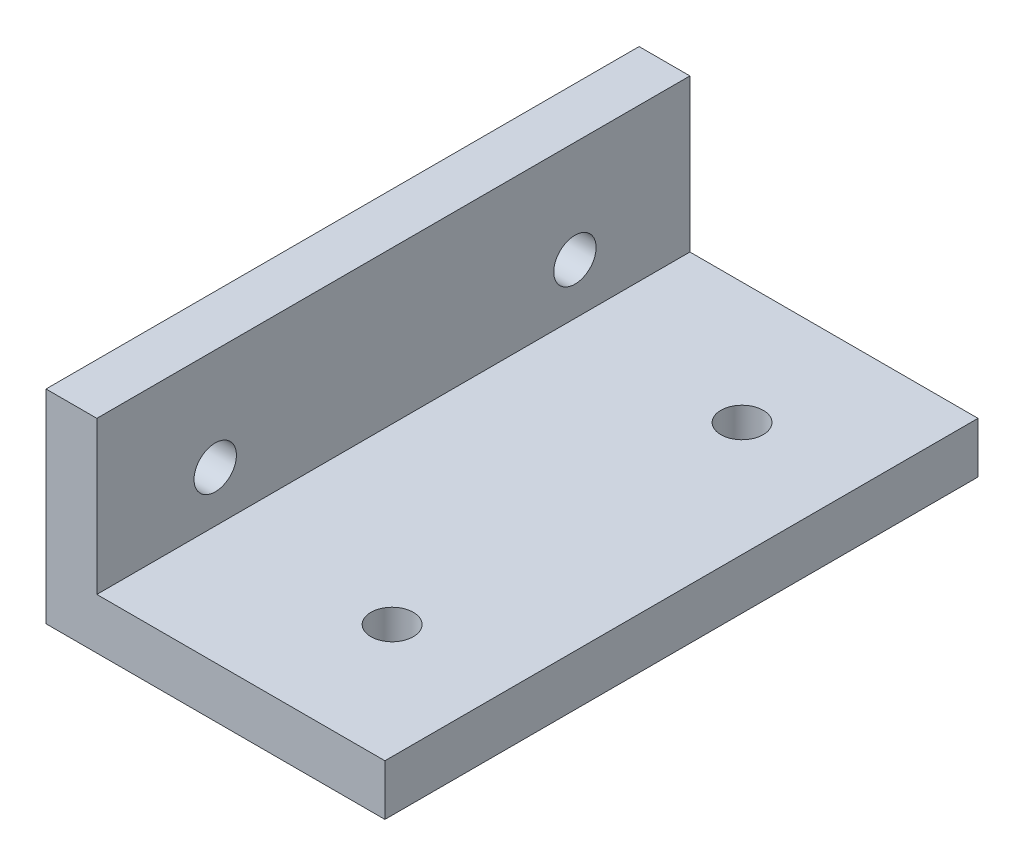
ISO-10303-21;
HEADER;
FILE_DESCRIPTION(('STEP AP214'),'2;1');
FILE_NAME('part.step','',(''),(''),'','','');
FILE_SCHEMA(('AUTOMOTIVE_DESIGN { 1 0 10303 214 1 1 1 1 }'));
ENDSEC;
DATA;
#1=APPLICATION_CONTEXT('core data for automotive mechanical design processes');
#2=APPLICATION_PROTOCOL_DEFINITION('international standard','automotive_design',2000,#1);
#3=PRODUCT_CONTEXT('',#1,'mechanical');
#4=PRODUCT('Part','Part','',(#3));
#5=PRODUCT_RELATED_PRODUCT_CATEGORY('part','',(#4));
#6=PRODUCT_DEFINITION_FORMATION('','',#4);
#7=PRODUCT_DEFINITION_CONTEXT('part definition',#1,'design');
#8=PRODUCT_DEFINITION('design','',#6,#7);
#9=PRODUCT_DEFINITION_SHAPE('','',#8);
#10=(LENGTH_UNIT() NAMED_UNIT(*) SI_UNIT(.MILLI.,.METRE.));
#11=(NAMED_UNIT(*) PLANE_ANGLE_UNIT() SI_UNIT($,.RADIAN.));
#12=(NAMED_UNIT(*) SI_UNIT($,.STERADIAN.) SOLID_ANGLE_UNIT());
#13=UNCERTAINTY_MEASURE_WITH_UNIT(LENGTH_MEASURE(1.E-05),#10,'distance_accuracy_value','');
#14=(GEOMETRIC_REPRESENTATION_CONTEXT(3) GLOBAL_UNCERTAINTY_ASSIGNED_CONTEXT((#13)) GLOBAL_UNIT_ASSIGNED_CONTEXT((#10,
#11,#12)) REPRESENTATION_CONTEXT('',''));
#15=CARTESIAN_POINT('',(0.,0.,0.));
#16=DIRECTION('',(0.,0.,1.));
#17=DIRECTION('',(1.,0.,0.));
#18=AXIS2_PLACEMENT_3D('',#15,#16,#17);
#19=CARTESIAN_POINT('',(0.,0.,35.));
#20=DIRECTION('',(1.,0.,0.));
#21=DIRECTION('',(0.,0.,-1.));
#22=AXIS2_PLACEMENT_3D('',#19,#20,#21);
#23=PLANE('',#22);
#24=DIRECTION('',(0.,-1.,0.));
#25=VECTOR('',#24,1.);
#26=CARTESIAN_POINT('',(0.,0.,0.));
#27=LINE('',#26,#25);
#28=CARTESIAN_POINT('',(0.,12.,0.));
#29=VERTEX_POINT('',#28);
#30=CARTESIAN_POINT('',(0.,0.,0.));
#31=VERTEX_POINT('',#30);
#32=EDGE_CURVE('E82',#29,#31,#27,.T.);
#33=ORIENTED_EDGE('',*,*,#32,.T.);
#34=DIRECTION('',(0.,0.,-1.));
#35=VECTOR('',#34,1.);
#36=CARTESIAN_POINT('',(0.,0.,35.));
#37=LINE('',#36,#35);
#38=CARTESIAN_POINT('',(0.,0.,35.));
#39=VERTEX_POINT('',#38);
#40=EDGE_CURVE('E117',#39,#31,#37,.T.);
#41=ORIENTED_EDGE('',*,*,#40,.F.);
#42=DIRECTION('',(0.,-1.,0.));
#43=VECTOR('',#42,1.);
#44=CARTESIAN_POINT('',(0.,0.,35.));
#45=LINE('',#44,#43);
#46=CARTESIAN_POINT('',(0.,12.,35.));
#47=VERTEX_POINT('',#46);
#48=EDGE_CURVE('E53',#47,#39,#45,.T.);
#49=ORIENTED_EDGE('',*,*,#48,.F.);
#50=DIRECTION('',(0.,0.,-1.));
#51=VECTOR('',#50,1.);
#52=CARTESIAN_POINT('',(0.,12.,35.));
#53=LINE('',#52,#51);
#54=EDGE_CURVE('E113',#47,#29,#53,.T.);
#55=ORIENTED_EDGE('',*,*,#54,.T.);
#56=EDGE_LOOP('',(#33,#41,#49,#55));
#57=FACE_BOUND('',#56,.T.);
#58=CARTESIAN_POINT('',(0.,6.00000000029845,28.0132486540516));
#59=DIRECTION('',(-1.,0.,0.));
#60=DIRECTION('',(0.,0.,1.));
#61=AXIS2_PLACEMENT_3D('',#58,#59,#60);
#62=CIRCLE('',#61,1.24999999999999);
#63=CARTESIAN_POINT('',(0.,6.00000000029845,29.2632486540516));
#64=VERTEX_POINT('',#63);
#65=EDGE_CURVE('E151',#64,#64,#62,.T.);
#66=ORIENTED_EDGE('',*,*,#65,.F.);
#67=EDGE_LOOP('',(#66));
#68=FACE_BOUND('',#67,.T.);
#69=CARTESIAN_POINT('',(0.,6.00000000029836,6.78675134594789));
#70=DIRECTION('',(-1.,0.,0.));
#71=DIRECTION('',(0.,0.,1.));
#72=AXIS2_PLACEMENT_3D('',#69,#70,#71);
#73=CIRCLE('',#72,1.24999999999999);
#74=CARTESIAN_POINT('',(0.,6.00000000029836,8.03675134594788));
#75=VERTEX_POINT('',#74);
#76=EDGE_CURVE('E154',#75,#75,#73,.T.);
#77=ORIENTED_EDGE('',*,*,#76,.F.);
#78=EDGE_LOOP('',(#77));
#79=FACE_BOUND('',#78,.T.);
#80=ADVANCED_FACE('F36',(#57,#68,#79),#23,.F.);
#81=CARTESIAN_POINT('',(20.,0.,35.));
#82=DIRECTION('',(0.,1.,0.));
#83=DIRECTION('',(-1.,0.,0.));
#84=AXIS2_PLACEMENT_3D('',#81,#82,#83);
#85=PLANE('',#84);
#86=CARTESIAN_POINT('',(13.25,0.,27.8245735194569));
#87=DIRECTION('',(0.,1.,0.));
#88=DIRECTION('',(-1.,0.,0.));
#89=AXIS2_PLACEMENT_3D('',#86,#87,#88);
#90=CIRCLE('',#89,1.25);
#91=CARTESIAN_POINT('',(12.,0.,27.8245735194569));
#92=VERTEX_POINT('',#91);
#93=EDGE_CURVE('E168',#92,#92,#90,.T.);
#94=ORIENTED_EDGE('',*,*,#93,.T.);
#95=EDGE_LOOP('',(#94));
#96=FACE_BOUND('',#95,.T.);
#97=CARTESIAN_POINT('',(13.25,0.,7.17542648054273));
#98=DIRECTION('',(0.,1.,0.));
#99=DIRECTION('',(-1.,0.,0.));
#100=AXIS2_PLACEMENT_3D('',#97,#98,#99);
#101=CIRCLE('',#100,1.25);
#102=CARTESIAN_POINT('',(12.,0.,7.17542648054273));
#103=VERTEX_POINT('',#102);
#104=EDGE_CURVE('E125',#103,#103,#101,.T.);
#105=ORIENTED_EDGE('',*,*,#104,.T.);
#106=EDGE_LOOP('',(#105));
#107=FACE_BOUND('',#106,.T.);
#108=DIRECTION('',(1.,0.,0.));
#109=VECTOR('',#108,1.);
#110=CARTESIAN_POINT('',(20.,0.,0.));
#111=LINE('',#110,#109);
#112=CARTESIAN_POINT('',(20.,0.,0.));
#113=VERTEX_POINT('',#112);
#114=EDGE_CURVE('E121',#31,#113,#111,.T.);
#115=ORIENTED_EDGE('',*,*,#114,.T.);
#116=DIRECTION('',(0.,0.,-1.));
#117=VECTOR('',#116,1.);
#118=CARTESIAN_POINT('',(20.,0.,35.));
#119=LINE('',#118,#117);
#120=CARTESIAN_POINT('',(20.,0.,35.));
#121=VERTEX_POINT('',#120);
#122=EDGE_CURVE('E11',#121,#113,#119,.T.);
#123=ORIENTED_EDGE('',*,*,#122,.F.);
#124=DIRECTION('',(1.,0.,0.));
#125=VECTOR('',#124,1.);
#126=CARTESIAN_POINT('',(20.,0.,35.));
#127=LINE('',#126,#125);
#128=EDGE_CURVE('E132',#39,#121,#127,.T.);
#129=ORIENTED_EDGE('',*,*,#128,.F.);
#130=ORIENTED_EDGE('',*,*,#40,.T.);
#131=EDGE_LOOP('',(#115,#123,#129,#130));
#132=FACE_BOUND('',#131,.T.);
#133=ADVANCED_FACE('F38',(#96,#107,#132),#85,.F.);
#134=CARTESIAN_POINT('',(20.,3.,35.));
#135=DIRECTION('',(-1.,0.,0.));
#136=DIRECTION('',(0.,-1.,0.));
#137=AXIS2_PLACEMENT_3D('',#134,#135,#136);
#138=PLANE('',#137);
#139=DIRECTION('',(0.,1.,0.));
#140=VECTOR('',#139,1.);
#141=CARTESIAN_POINT('',(20.,3.,0.));
#142=LINE('',#141,#140);
#143=CARTESIAN_POINT('',(20.,3.,0.));
#144=VERTEX_POINT('',#143);
#145=EDGE_CURVE('E124',#113,#144,#142,.T.);
#146=ORIENTED_EDGE('',*,*,#145,.T.);
#147=DIRECTION('',(0.,0.,-1.));
#148=VECTOR('',#147,1.);
#149=CARTESIAN_POINT('',(20.,3.,35.));
#150=LINE('',#149,#148);
#151=CARTESIAN_POINT('',(20.,3.,35.));
#152=VERTEX_POINT('',#151);
#153=EDGE_CURVE('E45',#152,#144,#150,.T.);
#154=ORIENTED_EDGE('',*,*,#153,.F.);
#155=DIRECTION('',(0.,1.,0.));
#156=VECTOR('',#155,1.);
#157=CARTESIAN_POINT('',(20.,3.,35.));
#158=LINE('',#157,#156);
#159=EDGE_CURVE('E90',#121,#152,#158,.T.);
#160=ORIENTED_EDGE('',*,*,#159,.F.);
#161=ORIENTED_EDGE('',*,*,#122,.T.);
#162=EDGE_LOOP('',(#146,#154,#160,#161));
#163=FACE_BOUND('',#162,.T.);
#164=ADVANCED_FACE('F203',(#163),#138,.F.);
#165=CARTESIAN_POINT('',(3.,3.,35.));
#166=DIRECTION('',(0.,-1.,0.));
#167=DIRECTION('',(0.,0.,-1.));
#168=AXIS2_PLACEMENT_3D('',#165,#166,#167);
#169=PLANE('',#168);
#170=CARTESIAN_POINT('',(13.25,3.,27.8245735194569));
#171=DIRECTION('',(0.,1.,0.));
#172=DIRECTION('',(0.,0.,1.));
#173=AXIS2_PLACEMENT_3D('',#170,#171,#172);
#174=CIRCLE('',#173,1.25);
#175=CARTESIAN_POINT('',(13.25,3.,29.0745735194569));
#176=VERTEX_POINT('',#175);
#177=EDGE_CURVE('E165',#176,#176,#174,.T.);
#178=ORIENTED_EDGE('',*,*,#177,.F.);
#179=EDGE_LOOP('',(#178));
#180=FACE_BOUND('',#179,.T.);
#181=CARTESIAN_POINT('',(13.25,3.,7.17542648054273));
#182=DIRECTION('',(0.,1.,0.));
#183=DIRECTION('',(0.,0.,1.));
#184=AXIS2_PLACEMENT_3D('',#181,#182,#183);
#185=CIRCLE('',#184,1.25);
#186=CARTESIAN_POINT('',(13.25,3.,8.42542648054273));
#187=VERTEX_POINT('',#186);
#188=EDGE_CURVE('E171',#187,#187,#185,.T.);
#189=ORIENTED_EDGE('',*,*,#188,.F.);
#190=EDGE_LOOP('',(#189));
#191=FACE_BOUND('',#190,.T.);
#192=DIRECTION('',(-1.,0.,0.));
#193=VECTOR('',#192,1.);
#194=CARTESIAN_POINT('',(3.,3.,0.));
#195=LINE('',#194,#193);
#196=CARTESIAN_POINT('',(3.,3.,0.));
#197=VERTEX_POINT('',#196);
#198=EDGE_CURVE('E127',#144,#197,#195,.T.);
#199=ORIENTED_EDGE('',*,*,#198,.T.);
#200=DIRECTION('',(0.,0.,-1.));
#201=VECTOR('',#200,1.);
#202=CARTESIAN_POINT('',(3.,3.,35.));
#203=LINE('',#202,#201);
#204=CARTESIAN_POINT('',(3.,3.,35.));
#205=VERTEX_POINT('',#204);
#206=EDGE_CURVE('E112',#205,#197,#203,.T.);
#207=ORIENTED_EDGE('',*,*,#206,.F.);
#208=DIRECTION('',(-1.,0.,0.));
#209=VECTOR('',#208,1.);
#210=CARTESIAN_POINT('',(3.,3.,35.));
#211=LINE('',#210,#209);
#212=EDGE_CURVE('E103',#152,#205,#211,.T.);
#213=ORIENTED_EDGE('',*,*,#212,.F.);
#214=ORIENTED_EDGE('',*,*,#153,.T.);
#215=EDGE_LOOP('',(#199,#207,#213,#214));
#216=FACE_BOUND('',#215,.T.);
#217=ADVANCED_FACE('F138',(#180,#191,#216),#169,.F.);
#218=CARTESIAN_POINT('',(3.,12.,35.));
#219=DIRECTION('',(-1.,0.,0.));
#220=DIRECTION('',(0.,-1.,0.));
#221=AXIS2_PLACEMENT_3D('',#218,#219,#220);
#222=PLANE('',#221);
#223=CARTESIAN_POINT('',(3.,6.00000000029836,6.78675134594789));
#224=DIRECTION('',(-1.,0.,0.));
#225=DIRECTION('',(0.,-1.,0.));
#226=AXIS2_PLACEMENT_3D('',#223,#224,#225);
#227=CIRCLE('',#226,1.24999999999999);
#228=CARTESIAN_POINT('',(3.,4.75000000029837,6.78675134594789));
#229=VERTEX_POINT('',#228);
#230=EDGE_CURVE('E156',#229,#229,#227,.T.);
#231=ORIENTED_EDGE('',*,*,#230,.T.);
#232=EDGE_LOOP('',(#231));
#233=FACE_BOUND('',#232,.T.);
#234=CARTESIAN_POINT('',(3.,6.00000000029845,28.0132486540516));
#235=DIRECTION('',(-1.,0.,0.));
#236=DIRECTION('',(0.,-1.,0.));
#237=AXIS2_PLACEMENT_3D('',#234,#235,#236);
#238=CIRCLE('',#237,1.24999999999999);
#239=CARTESIAN_POINT('',(3.,4.75000000029846,28.0132486540516));
#240=VERTEX_POINT('',#239);
#241=EDGE_CURVE('E162',#240,#240,#238,.T.);
#242=ORIENTED_EDGE('',*,*,#241,.T.);
#243=EDGE_LOOP('',(#242));
#244=FACE_BOUND('',#243,.T.);
#245=DIRECTION('',(0.,1.,0.));
#246=VECTOR('',#245,1.);
#247=CARTESIAN_POINT('',(3.,12.,0.));
#248=LINE('',#247,#246);
#249=CARTESIAN_POINT('',(3.,12.,0.));
#250=VERTEX_POINT('',#249);
#251=EDGE_CURVE('E111',#197,#250,#248,.T.);
#252=ORIENTED_EDGE('',*,*,#251,.T.);
#253=DIRECTION('',(0.,0.,-1.));
#254=VECTOR('',#253,1.);
#255=CARTESIAN_POINT('',(3.,12.,35.));
#256=LINE('',#255,#254);
#257=CARTESIAN_POINT('',(3.,12.,35.));
#258=VERTEX_POINT('',#257);
#259=EDGE_CURVE('E108',#258,#250,#256,.T.);
#260=ORIENTED_EDGE('',*,*,#259,.F.);
#261=DIRECTION('',(0.,1.,0.));
#262=VECTOR('',#261,1.);
#263=CARTESIAN_POINT('',(3.,12.,35.));
#264=LINE('',#263,#262);
#265=EDGE_CURVE('E97',#205,#258,#264,.T.);
#266=ORIENTED_EDGE('',*,*,#265,.F.);
#267=ORIENTED_EDGE('',*,*,#206,.T.);
#268=EDGE_LOOP('',(#252,#260,#266,#267));
#269=FACE_BOUND('',#268,.T.);
#270=ADVANCED_FACE('F109',(#233,#244,#269),#222,.F.);
#271=CARTESIAN_POINT('',(0.,12.,35.));
#272=DIRECTION('',(0.,-1.,0.));
#273=DIRECTION('',(1.,0.,0.));
#274=AXIS2_PLACEMENT_3D('',#271,#272,#273);
#275=PLANE('',#274);
#276=DIRECTION('',(-1.,0.,0.));
#277=VECTOR('',#276,1.);
#278=CARTESIAN_POINT('',(0.,12.,0.));
#279=LINE('',#278,#277);
#280=EDGE_CURVE('E76',#250,#29,#279,.T.);
#281=ORIENTED_EDGE('',*,*,#280,.T.);
#282=ORIENTED_EDGE('',*,*,#54,.F.);
#283=DIRECTION('',(-1.,0.,0.));
#284=VECTOR('',#283,1.);
#285=CARTESIAN_POINT('',(0.,12.,35.));
#286=LINE('',#285,#284);
#287=EDGE_CURVE('E101',#258,#47,#286,.T.);
#288=ORIENTED_EDGE('',*,*,#287,.F.);
#289=ORIENTED_EDGE('',*,*,#259,.T.);
#290=EDGE_LOOP('',(#281,#282,#288,#289));
#291=FACE_BOUND('',#290,.T.);
#292=ADVANCED_FACE('F115',(#291),#275,.F.);
#293=CARTESIAN_POINT('',(0.,0.,35.));
#294=DIRECTION('',(0.,0.,-1.));
#295=DIRECTION('',(-1.,0.,0.));
#296=AXIS2_PLACEMENT_3D('',#293,#294,#295);
#297=PLANE('',#296);
#298=ORIENTED_EDGE('',*,*,#128,.T.);
#299=ORIENTED_EDGE('',*,*,#159,.T.);
#300=ORIENTED_EDGE('',*,*,#212,.T.);
#301=ORIENTED_EDGE('',*,*,#265,.T.);
#302=ORIENTED_EDGE('',*,*,#287,.T.);
#303=ORIENTED_EDGE('',*,*,#48,.T.);
#304=EDGE_LOOP('',(#298,#299,#300,#301,#302,#303));
#305=FACE_BOUND('',#304,.T.);
#306=ADVANCED_FACE('F99',(#305),#297,.F.);
#307=CARTESIAN_POINT('',(0.,0.,0.));
#308=DIRECTION('',(0.,0.,-1.));
#309=DIRECTION('',(-1.,0.,0.));
#310=AXIS2_PLACEMENT_3D('',#307,#308,#309);
#311=PLANE('',#310);
#312=ORIENTED_EDGE('',*,*,#114,.F.);
#313=ORIENTED_EDGE('',*,*,#32,.F.);
#314=ORIENTED_EDGE('',*,*,#280,.F.);
#315=ORIENTED_EDGE('',*,*,#251,.F.);
#316=ORIENTED_EDGE('',*,*,#198,.F.);
#317=ORIENTED_EDGE('',*,*,#145,.F.);
#318=EDGE_LOOP('',(#312,#313,#314,#315,#316,#317));
#319=FACE_BOUND('',#318,.T.);
#320=ADVANCED_FACE('F141',(#319),#311,.T.);
#321=CARTESIAN_POINT('',(13.25,3.,7.17542648054273));
#322=DIRECTION('',(0.,1.,0.));
#323=DIRECTION('',(0.,0.,1.));
#324=AXIS2_PLACEMENT_3D('',#321,#322,#323);
#325=CYLINDRICAL_SURFACE('',#324,1.25);
#326=ORIENTED_EDGE('',*,*,#188,.T.);
#327=EDGE_LOOP('',(#326));
#328=FACE_BOUND('',#327,.T.);
#329=ORIENTED_EDGE('',*,*,#104,.F.);
#330=EDGE_LOOP('',(#329));
#331=FACE_BOUND('',#330,.T.);
#332=ADVANCED_FACE('F180',(#328,#331),#325,.F.);
#333=CARTESIAN_POINT('',(13.25,3.,27.8245735194569));
#334=DIRECTION('',(0.,1.,0.));
#335=DIRECTION('',(0.,0.,1.));
#336=AXIS2_PLACEMENT_3D('',#333,#334,#335);
#337=CYLINDRICAL_SURFACE('',#336,1.25);
#338=ORIENTED_EDGE('',*,*,#177,.T.);
#339=EDGE_LOOP('',(#338));
#340=FACE_BOUND('',#339,.T.);
#341=ORIENTED_EDGE('',*,*,#93,.F.);
#342=EDGE_LOOP('',(#341));
#343=FACE_BOUND('',#342,.T.);
#344=ADVANCED_FACE('F182',(#340,#343),#337,.F.);
#345=CARTESIAN_POINT('',(0.,6.00000000029845,28.0132486540516));
#346=DIRECTION('',(-1.,0.,0.));
#347=DIRECTION('',(0.,0.,1.));
#348=AXIS2_PLACEMENT_3D('',#345,#346,#347);
#349=CYLINDRICAL_SURFACE('',#348,1.24999999999999);
#350=ORIENTED_EDGE('',*,*,#65,.T.);
#351=EDGE_LOOP('',(#350));
#352=FACE_BOUND('',#351,.T.);
#353=ORIENTED_EDGE('',*,*,#241,.F.);
#354=EDGE_LOOP('',(#353));
#355=FACE_BOUND('',#354,.T.);
#356=ADVANCED_FACE('F189',(#352,#355),#349,.F.);
#357=CARTESIAN_POINT('',(0.,6.00000000029836,6.78675134594789));
#358=DIRECTION('',(-1.,0.,0.));
#359=DIRECTION('',(0.,0.,1.));
#360=AXIS2_PLACEMENT_3D('',#357,#358,#359);
#361=CYLINDRICAL_SURFACE('',#360,1.24999999999999);
#362=ORIENTED_EDGE('',*,*,#76,.T.);
#363=EDGE_LOOP('',(#362));
#364=FACE_BOUND('',#363,.T.);
#365=ORIENTED_EDGE('',*,*,#230,.F.);
#366=EDGE_LOOP('',(#365));
#367=FACE_BOUND('',#366,.T.);
#368=ADVANCED_FACE('F243',(#364,#367),#361,.F.);
#369=CLOSED_SHELL('',(#80,#133,#164,#217,#270,#292,#306,#320,#332,#344,#356,#368));
#370=MANIFOLD_SOLID_BREP('B2',#369);
#371=ADVANCED_BREP_SHAPE_REPRESENTATION('',(#18,#370),#14);
#372=SHAPE_DEFINITION_REPRESENTATION(#9,#371);
ENDSEC;
END-ISO-10303-21;
